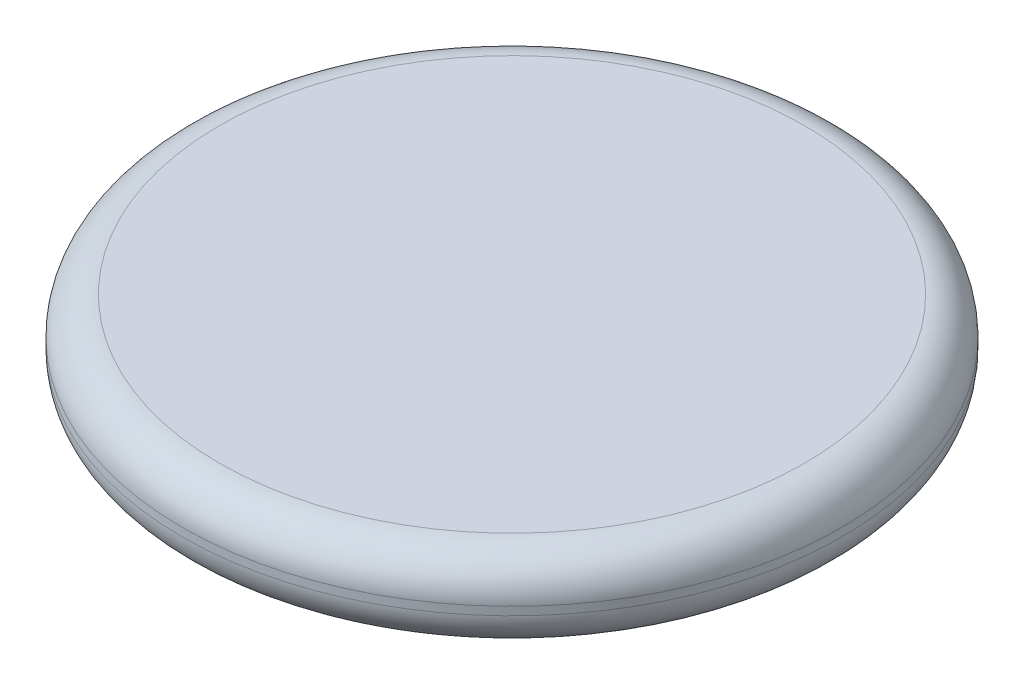
ISO-10303-21;
HEADER;
FILE_DESCRIPTION(('STEP AP214'),'2;1');
FILE_NAME('part.step','',(''),(''),'','','');
FILE_SCHEMA(('AUTOMOTIVE_DESIGN { 1 0 10303 214 1 1 1 1 }'));
ENDSEC;
DATA;
#1=APPLICATION_CONTEXT('core data for automotive mechanical design processes');
#2=APPLICATION_PROTOCOL_DEFINITION('international standard','automotive_design',2000,#1);
#3=PRODUCT_CONTEXT('',#1,'mechanical');
#4=PRODUCT('Part','Part','',(#3));
#5=PRODUCT_RELATED_PRODUCT_CATEGORY('part','',(#4));
#6=PRODUCT_DEFINITION_FORMATION('','',#4);
#7=PRODUCT_DEFINITION_CONTEXT('part definition',#1,'design');
#8=PRODUCT_DEFINITION('design','',#6,#7);
#9=PRODUCT_DEFINITION_SHAPE('','',#8);
#10=(LENGTH_UNIT() NAMED_UNIT(*) SI_UNIT(.MILLI.,.METRE.));
#11=(NAMED_UNIT(*) PLANE_ANGLE_UNIT() SI_UNIT($,.RADIAN.));
#12=(NAMED_UNIT(*) SI_UNIT($,.STERADIAN.) SOLID_ANGLE_UNIT());
#13=UNCERTAINTY_MEASURE_WITH_UNIT(LENGTH_MEASURE(1.E-05),#10,'distance_accuracy_value','');
#14=(GEOMETRIC_REPRESENTATION_CONTEXT(3) GLOBAL_UNCERTAINTY_ASSIGNED_CONTEXT((#13)) GLOBAL_UNIT_ASSIGNED_CONTEXT((#10,
#11,#12)) REPRESENTATION_CONTEXT('',''));
#15=CARTESIAN_POINT('',(0.,0.,0.));
#16=DIRECTION('',(0.,0.,1.));
#17=DIRECTION('',(1.,0.,0.));
#18=AXIS2_PLACEMENT_3D('',#15,#16,#17);
#19=CARTESIAN_POINT('',(0.,25.4,-381.));
#20=DIRECTION('',(0.,-1.,0.));
#21=DIRECTION('',(0.,0.,-1.));
#22=AXIS2_PLACEMENT_3D('',#19,#20,#21);
#23=CYLINDRICAL_SURFACE('',#22,101.6);
#24=CARTESIAN_POINT('',(0.,13.97,-381.));
#25=DIRECTION('',(0.,1.,0.));
#26=DIRECTION('',(0.,0.,1.));
#27=AXIS2_PLACEMENT_3D('',#24,#25,#26);
#28=CIRCLE('',#27,101.6);
#29=CARTESIAN_POINT('',(0.,13.97,-279.4));
#30=VERTEX_POINT('',#29);
#31=EDGE_CURVE('E38',#30,#30,#28,.F.);
#32=ORIENTED_EDGE('',*,*,#31,.T.);
#33=EDGE_LOOP('',(#32));
#34=FACE_BOUND('',#33,.T.);
#35=CARTESIAN_POINT('',(0.,11.43,-381.));
#36=DIRECTION('',(0.,1.,0.));
#37=DIRECTION('',(0.,0.,1.));
#38=AXIS2_PLACEMENT_3D('',#35,#36,#37);
#39=CIRCLE('',#38,101.6);
#40=CARTESIAN_POINT('',(0.,11.43,-279.4));
#41=VERTEX_POINT('',#40);
#42=EDGE_CURVE('E42',#41,#41,#39,.T.);
#43=ORIENTED_EDGE('',*,*,#42,.T.);
#44=EDGE_LOOP('',(#43));
#45=FACE_BOUND('',#44,.T.);
#46=ADVANCED_FACE('F31',(#34,#45),#23,.T.);
#47=CARTESIAN_POINT('',(0.,25.4,-381.));
#48=DIRECTION('',(0.,1.,0.));
#49=DIRECTION('',(0.,0.,1.));
#50=AXIS2_PLACEMENT_3D('',#47,#48,#49);
#51=PLANE('',#50);
#52=CARTESIAN_POINT('',(0.,25.4,-381.));
#53=DIRECTION('',(0.,1.,0.));
#54=DIRECTION('',(0.,0.,1.));
#55=AXIS2_PLACEMENT_3D('',#52,#53,#54);
#56=CIRCLE('',#55,90.17);
#57=CARTESIAN_POINT('',(0.,25.4,-290.83));
#58=VERTEX_POINT('',#57);
#59=EDGE_CURVE('E46',#58,#58,#56,.T.);
#60=ORIENTED_EDGE('',*,*,#59,.T.);
#61=EDGE_LOOP('',(#60));
#62=FACE_BOUND('',#61,.T.);
#63=ADVANCED_FACE('F52',(#62),#51,.T.);
#64=CARTESIAN_POINT('',(0.,0.,-381.));
#65=DIRECTION('',(0.,1.,0.));
#66=DIRECTION('',(0.,0.,1.));
#67=AXIS2_PLACEMENT_3D('',#64,#65,#66);
#68=PLANE('',#67);
#69=CARTESIAN_POINT('',(0.,0.,-381.));
#70=DIRECTION('',(0.,1.,0.));
#71=DIRECTION('',(0.,0.,1.));
#72=AXIS2_PLACEMENT_3D('',#69,#70,#71);
#73=CIRCLE('',#72,90.17);
#74=CARTESIAN_POINT('',(0.,0.,-290.83));
#75=VERTEX_POINT('',#74);
#76=EDGE_CURVE('E10',#75,#75,#73,.F.);
#77=ORIENTED_EDGE('',*,*,#76,.T.);
#78=EDGE_LOOP('',(#77));
#79=FACE_BOUND('',#78,.T.);
#80=ADVANCED_FACE('F56',(#79),#68,.F.);
#81=CARTESIAN_POINT('',(0.,13.97,-381.));
#82=DIRECTION('',(0.,1.,0.));
#83=DIRECTION('',(0.,0.,1.));
#84=AXIS2_PLACEMENT_3D('',#81,#82,#83);
#85=TOROIDAL_SURFACE('',#84,90.17,11.43);
#86=ORIENTED_EDGE('',*,*,#31,.F.);
#87=EDGE_LOOP('',(#86));
#88=FACE_BOUND('',#87,.T.);
#89=ORIENTED_EDGE('',*,*,#59,.F.);
#90=EDGE_LOOP('',(#89));
#91=FACE_BOUND('',#90,.T.);
#92=ADVANCED_FACE('F54',(#88,#91),#85,.T.);
#93=CARTESIAN_POINT('',(0.,11.43,-381.));
#94=DIRECTION('',(0.,1.,0.));
#95=DIRECTION('',(0.,0.,1.));
#96=AXIS2_PLACEMENT_3D('',#93,#94,#95);
#97=TOROIDAL_SURFACE('',#96,90.17,11.43);
#98=ORIENTED_EDGE('',*,*,#76,.F.);
#99=EDGE_LOOP('',(#98));
#100=FACE_BOUND('',#99,.T.);
#101=ORIENTED_EDGE('',*,*,#42,.F.);
#102=EDGE_LOOP('',(#101));
#103=FACE_BOUND('',#102,.T.);
#104=ADVANCED_FACE('F33',(#100,#103),#97,.T.);
#105=CLOSED_SHELL('',(#46,#63,#80,#92,#104));
#106=MANIFOLD_SOLID_BREP('B2',#105);
#107=ADVANCED_BREP_SHAPE_REPRESENTATION('',(#18,#106),#14);
#108=SHAPE_DEFINITION_REPRESENTATION(#9,#107);
ENDSEC;
END-ISO-10303-21;
